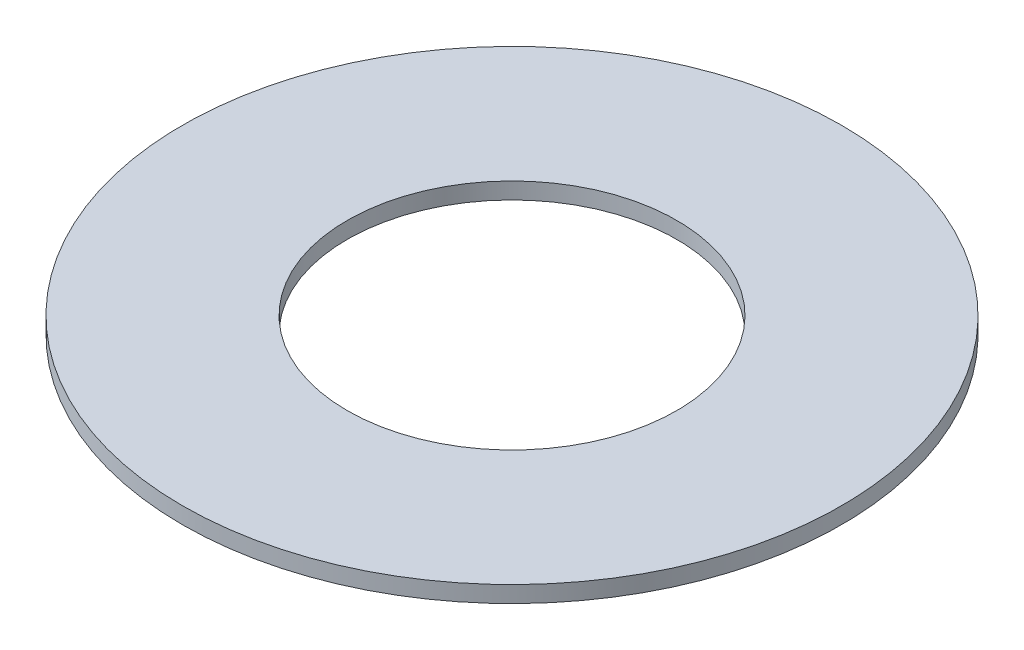
ISO-10303-21;
HEADER;
FILE_DESCRIPTION(('STEP AP214'),'2;1');
FILE_NAME('part.step','',(''),(''),'','','');
FILE_SCHEMA(('AUTOMOTIVE_DESIGN { 1 0 10303 214 1 1 1 1 }'));
ENDSEC;
DATA;
#1=APPLICATION_CONTEXT('core data for automotive mechanical design processes');
#2=APPLICATION_PROTOCOL_DEFINITION('international standard','automotive_design',2000,#1);
#3=PRODUCT_CONTEXT('',#1,'mechanical');
#4=PRODUCT('Part','Part','',(#3));
#5=PRODUCT_RELATED_PRODUCT_CATEGORY('part','',(#4));
#6=PRODUCT_DEFINITION_FORMATION('','',#4);
#7=PRODUCT_DEFINITION_CONTEXT('part definition',#1,'design');
#8=PRODUCT_DEFINITION('design','',#6,#7);
#9=PRODUCT_DEFINITION_SHAPE('','',#8);
#10=(LENGTH_UNIT() NAMED_UNIT(*) SI_UNIT(.MILLI.,.METRE.));
#11=(NAMED_UNIT(*) PLANE_ANGLE_UNIT() SI_UNIT($,.RADIAN.));
#12=(NAMED_UNIT(*) SI_UNIT($,.STERADIAN.) SOLID_ANGLE_UNIT());
#13=UNCERTAINTY_MEASURE_WITH_UNIT(LENGTH_MEASURE(1.E-05),#10,'distance_accuracy_value','');
#14=(GEOMETRIC_REPRESENTATION_CONTEXT(3) GLOBAL_UNCERTAINTY_ASSIGNED_CONTEXT((#13)) GLOBAL_UNIT_ASSIGNED_CONTEXT((#10,
#11,#12)) REPRESENTATION_CONTEXT('',''));
#15=CARTESIAN_POINT('',(0.,0.,0.));
#16=DIRECTION('',(0.,0.,1.));
#17=DIRECTION('',(1.,0.,0.));
#18=AXIS2_PLACEMENT_3D('',#15,#16,#17);
#19=CARTESIAN_POINT('',(0.,0.5,0.));
#20=DIRECTION('',(0.,1.,0.));
#21=DIRECTION('',(0.,0.,1.));
#22=AXIS2_PLACEMENT_3D('',#19,#20,#21);
#23=PLANE('',#22);
#24=CARTESIAN_POINT('',(0.,0.5,0.));
#25=DIRECTION('',(0.,1.,0.));
#26=DIRECTION('',(0.,0.,1.));
#27=AXIS2_PLACEMENT_3D('',#24,#25,#26);
#28=CIRCLE('',#27,10.);
#29=CARTESIAN_POINT('',(0.,0.5,10.));
#30=VERTEX_POINT('',#29);
#31=EDGE_CURVE('E10',#30,#30,#28,.T.);
#32=ORIENTED_EDGE('',*,*,#31,.T.);
#33=EDGE_LOOP('',(#32));
#34=FACE_BOUND('',#33,.T.);
#35=CARTESIAN_POINT('',(0.,0.5,0.));
#36=DIRECTION('',(0.,1.,0.));
#37=DIRECTION('',(0.,0.,1.));
#38=AXIS2_PLACEMENT_3D('',#35,#36,#37);
#39=CIRCLE('',#38,5.);
#40=CARTESIAN_POINT('',(0.,0.5,5.));
#41=VERTEX_POINT('',#40);
#42=EDGE_CURVE('E41',#41,#41,#39,.T.);
#43=ORIENTED_EDGE('',*,*,#42,.F.);
#44=EDGE_LOOP('',(#43));
#45=FACE_BOUND('',#44,.T.);
#46=ADVANCED_FACE('F30',(#34,#45),#23,.T.);
#47=CARTESIAN_POINT('',(0.,0.,0.));
#48=DIRECTION('',(0.,1.,0.));
#49=DIRECTION('',(0.,0.,1.));
#50=AXIS2_PLACEMENT_3D('',#47,#48,#49);
#51=PLANE('',#50);
#52=CARTESIAN_POINT('',(0.,0.,0.));
#53=DIRECTION('',(0.,1.,0.));
#54=DIRECTION('',(0.,0.,1.));
#55=AXIS2_PLACEMENT_3D('',#52,#53,#54);
#56=CIRCLE('',#55,10.);
#57=CARTESIAN_POINT('',(0.,0.,10.));
#58=VERTEX_POINT('',#57);
#59=EDGE_CURVE('E34',#58,#58,#56,.T.);
#60=ORIENTED_EDGE('',*,*,#59,.F.);
#61=EDGE_LOOP('',(#60));
#62=FACE_BOUND('',#61,.T.);
#63=CARTESIAN_POINT('',(0.,0.,0.));
#64=DIRECTION('',(0.,1.,0.));
#65=DIRECTION('',(0.,0.,1.));
#66=AXIS2_PLACEMENT_3D('',#63,#64,#65);
#67=CIRCLE('',#66,5.);
#68=CARTESIAN_POINT('',(0.,0.,5.));
#69=VERTEX_POINT('',#68);
#70=EDGE_CURVE('E43',#69,#69,#67,.T.);
#71=ORIENTED_EDGE('',*,*,#70,.T.);
#72=EDGE_LOOP('',(#71));
#73=FACE_BOUND('',#72,.T.);
#74=ADVANCED_FACE('F53',(#62,#73),#51,.F.);
#75=CARTESIAN_POINT('',(0.,0.5,0.));
#76=DIRECTION('',(0.,-1.,0.));
#77=DIRECTION('',(0.,0.,-1.));
#78=AXIS2_PLACEMENT_3D('',#75,#76,#77);
#79=CYLINDRICAL_SURFACE('',#78,10.);
#80=ORIENTED_EDGE('',*,*,#31,.F.);
#81=EDGE_LOOP('',(#80));
#82=FACE_BOUND('',#81,.T.);
#83=ORIENTED_EDGE('',*,*,#59,.T.);
#84=EDGE_LOOP('',(#83));
#85=FACE_BOUND('',#84,.T.);
#86=ADVANCED_FACE('F32',(#82,#85),#79,.T.);
#87=CARTESIAN_POINT('',(0.,0.5,0.));
#88=DIRECTION('',(0.,-1.,0.));
#89=DIRECTION('',(0.,0.,-1.));
#90=AXIS2_PLACEMENT_3D('',#87,#88,#89);
#91=CYLINDRICAL_SURFACE('',#90,5.);
#92=ORIENTED_EDGE('',*,*,#42,.T.);
#93=EDGE_LOOP('',(#92));
#94=FACE_BOUND('',#93,.T.);
#95=ORIENTED_EDGE('',*,*,#70,.F.);
#96=EDGE_LOOP('',(#95));
#97=FACE_BOUND('',#96,.T.);
#98=ADVANCED_FACE('F49',(#94,#97),#91,.F.);
#99=CLOSED_SHELL('',(#46,#74,#86,#98));
#100=MANIFOLD_SOLID_BREP('B2',#99);
#101=ADVANCED_BREP_SHAPE_REPRESENTATION('',(#18,#100),#14);
#102=SHAPE_DEFINITION_REPRESENTATION(#9,#101);
ENDSEC;
END-ISO-10303-21;
